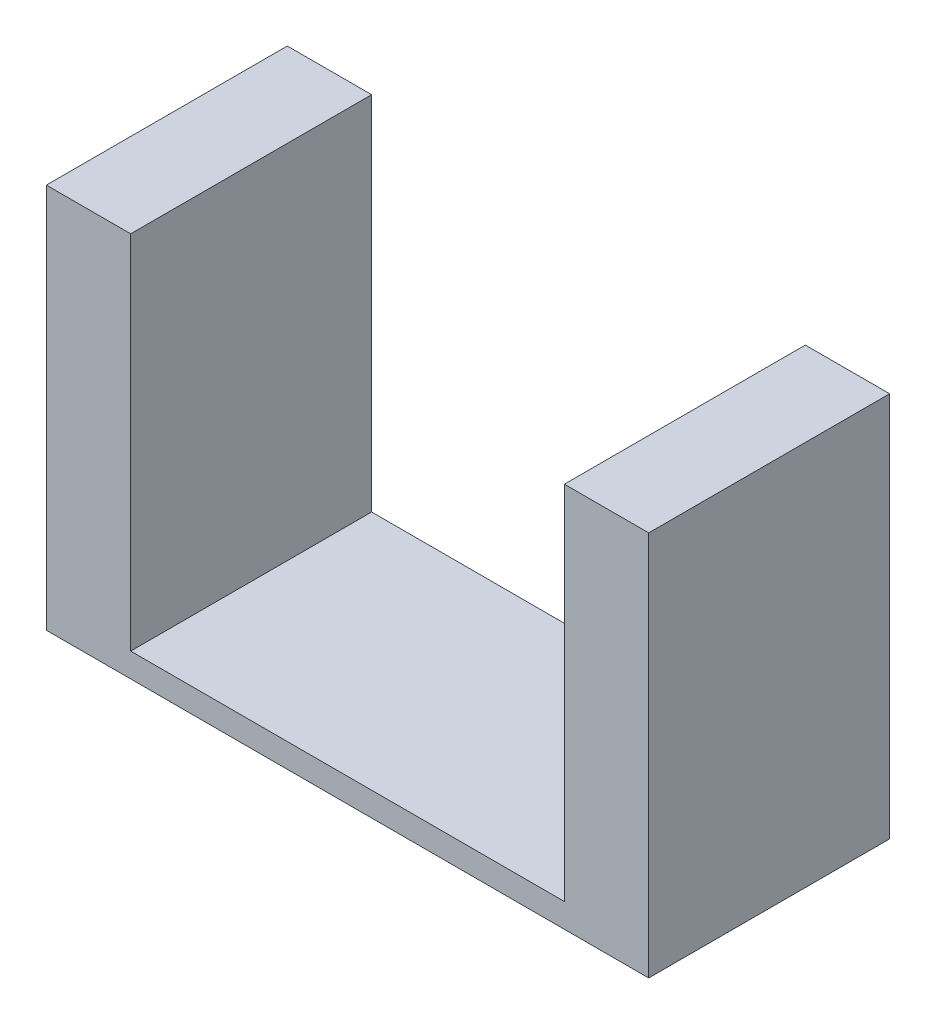
ISO-10303-21;
HEADER;
FILE_DESCRIPTION(('STEP AP214'),'2;1');
FILE_NAME('part.step','',(''),(''),'','','');
FILE_SCHEMA(('AUTOMOTIVE_DESIGN { 1 0 10303 214 1 1 1 1 }'));
ENDSEC;
DATA;
#1=APPLICATION_CONTEXT('core data for automotive mechanical design processes');
#2=APPLICATION_PROTOCOL_DEFINITION('international standard','automotive_design',2000,#1);
#3=PRODUCT_CONTEXT('',#1,'mechanical');
#4=PRODUCT('Part','Part','',(#3));
#5=PRODUCT_RELATED_PRODUCT_CATEGORY('part','',(#4));
#6=PRODUCT_DEFINITION_FORMATION('','',#4);
#7=PRODUCT_DEFINITION_CONTEXT('part definition',#1,'design');
#8=PRODUCT_DEFINITION('design','',#6,#7);
#9=PRODUCT_DEFINITION_SHAPE('','',#8);
#10=(LENGTH_UNIT() NAMED_UNIT(*) SI_UNIT(.MILLI.,.METRE.));
#11=(NAMED_UNIT(*) PLANE_ANGLE_UNIT() SI_UNIT($,.RADIAN.));
#12=(NAMED_UNIT(*) SI_UNIT($,.STERADIAN.) SOLID_ANGLE_UNIT());
#13=UNCERTAINTY_MEASURE_WITH_UNIT(LENGTH_MEASURE(1.E-05),#10,'distance_accuracy_value','');
#14=(GEOMETRIC_REPRESENTATION_CONTEXT(3) GLOBAL_UNCERTAINTY_ASSIGNED_CONTEXT((#13)) GLOBAL_UNIT_ASSIGNED_CONTEXT((#10,
#11,#12)) REPRESENTATION_CONTEXT('',''));
#15=CARTESIAN_POINT('',(0.,0.,0.));
#16=DIRECTION('',(0.,0.,1.));
#17=DIRECTION('',(1.,0.,0.));
#18=AXIS2_PLACEMENT_3D('',#15,#16,#17);
#19=CARTESIAN_POINT('',(0.,2.,0.));
#20=DIRECTION('',(0.,1.,0.));
#21=DIRECTION('',(0.,0.,1.));
#22=AXIS2_PLACEMENT_3D('',#19,#20,#21);
#23=PLANE('',#22);
#24=DIRECTION('',(1.,0.,0.));
#25=VECTOR('',#24,1.);
#26=CARTESIAN_POINT('',(-25.,2.,10.));
#27=LINE('',#26,#25);
#28=CARTESIAN_POINT('',(-18.,2.,10.));
#29=VERTEX_POINT('',#28);
#30=CARTESIAN_POINT('',(18.,2.,10.));
#31=VERTEX_POINT('',#30);
#32=EDGE_CURVE('E56',#29,#31,#27,.T.);
#33=ORIENTED_EDGE('',*,*,#32,.T.);
#34=DIRECTION('',(0.,0.,1.));
#35=VECTOR('',#34,1.);
#36=CARTESIAN_POINT('',(18.,2.,-10.));
#37=LINE('',#36,#35);
#38=CARTESIAN_POINT('',(18.,2.,-10.));
#39=VERTEX_POINT('',#38);
#40=EDGE_CURVE('E51',#39,#31,#37,.T.);
#41=ORIENTED_EDGE('',*,*,#40,.F.);
#42=DIRECTION('',(-1.,0.,0.));
#43=VECTOR('',#42,1.);
#44=CARTESIAN_POINT('',(-25.,2.,-10.));
#45=LINE('',#44,#43);
#46=CARTESIAN_POINT('',(-18.,2.,-10.));
#47=VERTEX_POINT('',#46);
#48=EDGE_CURVE('E37',#39,#47,#45,.T.);
#49=ORIENTED_EDGE('',*,*,#48,.T.);
#50=DIRECTION('',(0.,0.,-1.));
#51=VECTOR('',#50,1.);
#52=CARTESIAN_POINT('',(-18.,2.,-10.));
#53=LINE('',#52,#51);
#54=EDGE_CURVE('E128',#29,#47,#53,.T.);
#55=ORIENTED_EDGE('',*,*,#54,.F.);
#56=EDGE_LOOP('',(#33,#41,#49,#55));
#57=FACE_BOUND('',#56,.T.);
#58=ADVANCED_FACE('F33',(#57),#23,.T.);
#59=CARTESIAN_POINT('',(25.,2.,-10.));
#60=DIRECTION('',(-1.,0.,0.));
#61=DIRECTION('',(0.,0.,1.));
#62=AXIS2_PLACEMENT_3D('',#59,#60,#61);
#63=PLANE('',#62);
#64=DIRECTION('',(0.,0.,-1.));
#65=VECTOR('',#64,1.);
#66=CARTESIAN_POINT('',(25.,0.,-10.));
#67=LINE('',#66,#65);
#68=CARTESIAN_POINT('',(25.,0.,10.));
#69=VERTEX_POINT('',#68);
#70=CARTESIAN_POINT('',(25.,0.,-10.));
#71=VERTEX_POINT('',#70);
#72=EDGE_CURVE('E104',#69,#71,#67,.T.);
#73=ORIENTED_EDGE('',*,*,#72,.T.);
#74=DIRECTION('',(0.,-1.,0.));
#75=VECTOR('',#74,1.);
#76=CARTESIAN_POINT('',(25.,2.,-10.));
#77=LINE('',#76,#75);
#78=CARTESIAN_POINT('',(25.,32.,-10.));
#79=VERTEX_POINT('',#78);
#80=EDGE_CURVE('E11',#79,#71,#77,.T.);
#81=ORIENTED_EDGE('',*,*,#80,.F.);
#82=DIRECTION('',(0.,0.,-1.));
#83=VECTOR('',#82,1.);
#84=CARTESIAN_POINT('',(25.,32.,-10.));
#85=LINE('',#84,#83);
#86=CARTESIAN_POINT('',(25.,32.,10.));
#87=VERTEX_POINT('',#86);
#88=EDGE_CURVE('E102',#87,#79,#85,.T.);
#89=ORIENTED_EDGE('',*,*,#88,.F.);
#90=DIRECTION('',(0.,-1.,0.));
#91=VECTOR('',#90,1.);
#92=CARTESIAN_POINT('',(25.,2.,10.));
#93=LINE('',#92,#91);
#94=EDGE_CURVE('E166',#87,#69,#93,.T.);
#95=ORIENTED_EDGE('',*,*,#94,.T.);
#96=EDGE_LOOP('',(#73,#81,#89,#95));
#97=FACE_BOUND('',#96,.T.);
#98=ADVANCED_FACE('F35',(#97),#63,.F.);
#99=CARTESIAN_POINT('',(-25.,2.,-10.));
#100=DIRECTION('',(0.,0.,1.));
#101=DIRECTION('',(1.,0.,0.));
#102=AXIS2_PLACEMENT_3D('',#99,#100,#101);
#103=PLANE('',#102);
#104=DIRECTION('',(-1.,0.,0.));
#105=VECTOR('',#104,1.);
#106=CARTESIAN_POINT('',(-25.,0.,-10.));
#107=LINE('',#106,#105);
#108=CARTESIAN_POINT('',(-25.,0.,-10.));
#109=VERTEX_POINT('',#108);
#110=EDGE_CURVE('E157',#71,#109,#107,.T.);
#111=ORIENTED_EDGE('',*,*,#110,.T.);
#112=DIRECTION('',(0.,-1.,0.));
#113=VECTOR('',#112,1.);
#114=CARTESIAN_POINT('',(-25.,2.,-10.));
#115=LINE('',#114,#113);
#116=CARTESIAN_POINT('',(-25.,32.,-10.));
#117=VERTEX_POINT('',#116);
#118=EDGE_CURVE('E43',#117,#109,#115,.T.);
#119=ORIENTED_EDGE('',*,*,#118,.F.);
#120=DIRECTION('',(-1.,0.,0.));
#121=VECTOR('',#120,1.);
#122=CARTESIAN_POINT('',(-25.,32.,-10.));
#123=LINE('',#122,#121);
#124=CARTESIAN_POINT('',(-18.,32.,-10.));
#125=VERTEX_POINT('',#124);
#126=EDGE_CURVE('E136',#125,#117,#123,.T.);
#127=ORIENTED_EDGE('',*,*,#126,.F.);
#128=DIRECTION('',(0.,-1.,0.));
#129=VECTOR('',#128,1.);
#130=CARTESIAN_POINT('',(-18.,32.,-10.));
#131=LINE('',#130,#129);
#132=EDGE_CURVE('E139',#125,#47,#131,.T.);
#133=ORIENTED_EDGE('',*,*,#132,.T.);
#134=ORIENTED_EDGE('',*,*,#48,.F.);
#135=DIRECTION('',(0.,-1.,0.));
#136=VECTOR('',#135,1.);
#137=CARTESIAN_POINT('',(18.,32.,-10.));
#138=LINE('',#137,#136);
#139=CARTESIAN_POINT('',(18.,32.,-10.));
#140=VERTEX_POINT('',#139);
#141=EDGE_CURVE('E110',#140,#39,#138,.T.);
#142=ORIENTED_EDGE('',*,*,#141,.F.);
#143=DIRECTION('',(-1.,0.,0.));
#144=VECTOR('',#143,1.);
#145=CARTESIAN_POINT('',(25.,32.,-10.));
#146=LINE('',#145,#144);
#147=EDGE_CURVE('E107',#79,#140,#146,.T.);
#148=ORIENTED_EDGE('',*,*,#147,.F.);
#149=ORIENTED_EDGE('',*,*,#80,.T.);
#150=EDGE_LOOP('',(#111,#119,#127,#133,#134,#142,#148,#149));
#151=FACE_BOUND('',#150,.T.);
#152=ADVANCED_FACE('F108',(#151),#103,.F.);
#153=CARTESIAN_POINT('',(-25.,2.,-10.));
#154=DIRECTION('',(1.,0.,0.));
#155=DIRECTION('',(0.,0.,-1.));
#156=AXIS2_PLACEMENT_3D('',#153,#154,#155);
#157=PLANE('',#156);
#158=DIRECTION('',(0.,0.,1.));
#159=VECTOR('',#158,1.);
#160=CARTESIAN_POINT('',(-25.,0.,-10.));
#161=LINE('',#160,#159);
#162=CARTESIAN_POINT('',(-25.,0.,10.));
#163=VERTEX_POINT('',#162);
#164=EDGE_CURVE('E159',#109,#163,#161,.T.);
#165=ORIENTED_EDGE('',*,*,#164,.T.);
#166=DIRECTION('',(0.,-1.,0.));
#167=VECTOR('',#166,1.);
#168=CARTESIAN_POINT('',(-25.,2.,10.));
#169=LINE('',#168,#167);
#170=CARTESIAN_POINT('',(-25.,32.,10.));
#171=VERTEX_POINT('',#170);
#172=EDGE_CURVE('E168',#171,#163,#169,.T.);
#173=ORIENTED_EDGE('',*,*,#172,.F.);
#174=DIRECTION('',(0.,0.,1.));
#175=VECTOR('',#174,1.);
#176=CARTESIAN_POINT('',(-25.,32.,-10.));
#177=LINE('',#176,#175);
#178=EDGE_CURVE('E129',#117,#171,#177,.T.);
#179=ORIENTED_EDGE('',*,*,#178,.F.);
#180=ORIENTED_EDGE('',*,*,#118,.T.);
#181=EDGE_LOOP('',(#165,#173,#179,#180));
#182=FACE_BOUND('',#181,.T.);
#183=ADVANCED_FACE('F175',(#182),#157,.F.);
#184=CARTESIAN_POINT('',(-25.,2.,10.));
#185=DIRECTION('',(0.,0.,-1.));
#186=DIRECTION('',(-1.,0.,0.));
#187=AXIS2_PLACEMENT_3D('',#184,#185,#186);
#188=PLANE('',#187);
#189=DIRECTION('',(1.,0.,0.));
#190=VECTOR('',#189,1.);
#191=CARTESIAN_POINT('',(-25.,0.,10.));
#192=LINE('',#191,#190);
#193=EDGE_CURVE('E164',#163,#69,#192,.T.);
#194=ORIENTED_EDGE('',*,*,#193,.T.);
#195=ORIENTED_EDGE('',*,*,#94,.F.);
#196=DIRECTION('',(1.,0.,0.));
#197=VECTOR('',#196,1.);
#198=CARTESIAN_POINT('',(25.,32.,10.));
#199=LINE('',#198,#197);
#200=CARTESIAN_POINT('',(18.,32.,10.));
#201=VERTEX_POINT('',#200);
#202=EDGE_CURVE('E118',#201,#87,#199,.T.);
#203=ORIENTED_EDGE('',*,*,#202,.F.);
#204=DIRECTION('',(0.,-1.,0.));
#205=VECTOR('',#204,1.);
#206=CARTESIAN_POINT('',(18.,32.,10.));
#207=LINE('',#206,#205);
#208=EDGE_CURVE('E123',#201,#31,#207,.T.);
#209=ORIENTED_EDGE('',*,*,#208,.T.);
#210=ORIENTED_EDGE('',*,*,#32,.F.);
#211=DIRECTION('',(0.,-1.,0.));
#212=VECTOR('',#211,1.);
#213=CARTESIAN_POINT('',(-18.,32.,10.));
#214=LINE('',#213,#212);
#215=CARTESIAN_POINT('',(-18.,32.,10.));
#216=VERTEX_POINT('',#215);
#217=EDGE_CURVE('E149',#216,#29,#214,.T.);
#218=ORIENTED_EDGE('',*,*,#217,.F.);
#219=DIRECTION('',(1.,0.,0.));
#220=VECTOR('',#219,1.);
#221=CARTESIAN_POINT('',(-25.,32.,10.));
#222=LINE('',#221,#220);
#223=EDGE_CURVE('E132',#171,#216,#222,.T.);
#224=ORIENTED_EDGE('',*,*,#223,.F.);
#225=ORIENTED_EDGE('',*,*,#172,.T.);
#226=EDGE_LOOP('',(#194,#195,#203,#209,#210,#218,#224,#225));
#227=FACE_BOUND('',#226,.T.);
#228=ADVANCED_FACE('F181',(#227),#188,.F.);
#229=CARTESIAN_POINT('',(0.,0.,0.));
#230=DIRECTION('',(0.,1.,0.));
#231=DIRECTION('',(0.,0.,1.));
#232=AXIS2_PLACEMENT_3D('',#229,#230,#231);
#233=PLANE('',#232);
#234=ORIENTED_EDGE('',*,*,#72,.F.);
#235=ORIENTED_EDGE('',*,*,#193,.F.);
#236=ORIENTED_EDGE('',*,*,#164,.F.);
#237=ORIENTED_EDGE('',*,*,#110,.F.);
#238=EDGE_LOOP('',(#234,#235,#236,#237));
#239=FACE_BOUND('',#238,.T.);
#240=ADVANCED_FACE('F179',(#239),#233,.F.);
#241=CARTESIAN_POINT('',(-18.,32.,-10.));
#242=DIRECTION('',(-1.,0.,0.));
#243=DIRECTION('',(0.,0.,1.));
#244=AXIS2_PLACEMENT_3D('',#241,#242,#243);
#245=PLANE('',#244);
#246=ORIENTED_EDGE('',*,*,#54,.T.);
#247=ORIENTED_EDGE('',*,*,#132,.F.);
#248=DIRECTION('',(0.,0.,-1.));
#249=VECTOR('',#248,1.);
#250=CARTESIAN_POINT('',(-18.,32.,-10.));
#251=LINE('',#250,#249);
#252=EDGE_CURVE('E134',#216,#125,#251,.T.);
#253=ORIENTED_EDGE('',*,*,#252,.F.);
#254=ORIENTED_EDGE('',*,*,#217,.T.);
#255=EDGE_LOOP('',(#246,#247,#253,#254));
#256=FACE_BOUND('',#255,.T.);
#257=ADVANCED_FACE('F186',(#256),#245,.F.);
#258=CARTESIAN_POINT('',(0.,32.,0.));
#259=DIRECTION('',(0.,1.,0.));
#260=DIRECTION('',(0.,0.,1.));
#261=AXIS2_PLACEMENT_3D('',#258,#259,#260);
#262=PLANE('',#261);
#263=ORIENTED_EDGE('',*,*,#178,.T.);
#264=ORIENTED_EDGE('',*,*,#223,.T.);
#265=ORIENTED_EDGE('',*,*,#252,.T.);
#266=ORIENTED_EDGE('',*,*,#126,.T.);
#267=EDGE_LOOP('',(#263,#264,#265,#266));
#268=FACE_BOUND('',#267,.T.);
#269=ADVANCED_FACE('F184',(#268),#262,.T.);
#270=CARTESIAN_POINT('',(18.,32.,-10.));
#271=DIRECTION('',(1.,0.,0.));
#272=DIRECTION('',(0.,0.,-1.));
#273=AXIS2_PLACEMENT_3D('',#270,#271,#272);
#274=PLANE('',#273);
#275=ORIENTED_EDGE('',*,*,#40,.T.);
#276=ORIENTED_EDGE('',*,*,#208,.F.);
#277=DIRECTION('',(0.,0.,1.));
#278=VECTOR('',#277,1.);
#279=CARTESIAN_POINT('',(18.,32.,-10.));
#280=LINE('',#279,#278);
#281=EDGE_CURVE('E113',#140,#201,#280,.T.);
#282=ORIENTED_EDGE('',*,*,#281,.F.);
#283=ORIENTED_EDGE('',*,*,#141,.T.);
#284=EDGE_LOOP('',(#275,#276,#282,#283));
#285=FACE_BOUND('',#284,.T.);
#286=ADVANCED_FACE('F189',(#285),#274,.F.);
#287=CARTESIAN_POINT('',(0.,32.,0.));
#288=DIRECTION('',(0.,-1.,0.));
#289=DIRECTION('',(0.,0.,-1.));
#290=AXIS2_PLACEMENT_3D('',#287,#288,#289);
#291=PLANE('',#290);
#292=ORIENTED_EDGE('',*,*,#88,.T.);
#293=ORIENTED_EDGE('',*,*,#147,.T.);
#294=ORIENTED_EDGE('',*,*,#281,.T.);
#295=ORIENTED_EDGE('',*,*,#202,.T.);
#296=EDGE_LOOP('',(#292,#293,#294,#295));
#297=FACE_BOUND('',#296,.T.);
#298=ADVANCED_FACE('F116',(#297),#291,.F.);
#299=CLOSED_SHELL('',(#58,#98,#152,#183,#228,#240,#257,#269,#286,#298));
#300=MANIFOLD_SOLID_BREP('B2',#299);
#301=ADVANCED_BREP_SHAPE_REPRESENTATION('',(#18,#300),#14);
#302=SHAPE_DEFINITION_REPRESENTATION(#9,#301);
ENDSEC;
END-ISO-10303-21;
